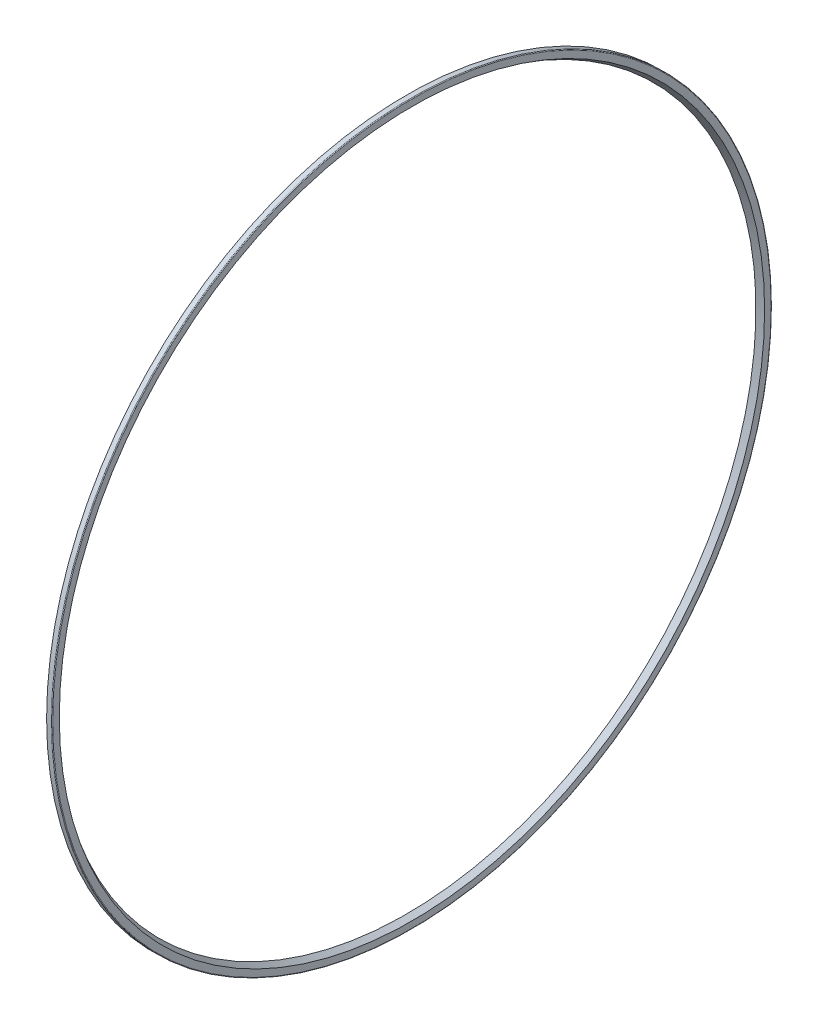
ISO-10303-21;
HEADER;
FILE_DESCRIPTION(('STEP AP214'),'2;1');
FILE_NAME('part.step','',(''),(''),'','','');
FILE_SCHEMA(('AUTOMOTIVE_DESIGN { 1 0 10303 214 1 1 1 1 }'));
ENDSEC;
DATA;
#1=APPLICATION_CONTEXT('core data for automotive mechanical design processes');
#2=APPLICATION_PROTOCOL_DEFINITION('international standard','automotive_design',2000,#1);
#3=PRODUCT_CONTEXT('',#1,'mechanical');
#4=PRODUCT('Part','Part','',(#3));
#5=PRODUCT_RELATED_PRODUCT_CATEGORY('part','',(#4));
#6=PRODUCT_DEFINITION_FORMATION('','',#4);
#7=PRODUCT_DEFINITION_CONTEXT('part definition',#1,'design');
#8=PRODUCT_DEFINITION('design','',#6,#7);
#9=PRODUCT_DEFINITION_SHAPE('','',#8);
#10=(LENGTH_UNIT() NAMED_UNIT(*) SI_UNIT(.MILLI.,.METRE.));
#11=(NAMED_UNIT(*) PLANE_ANGLE_UNIT() SI_UNIT($,.RADIAN.));
#12=(NAMED_UNIT(*) SI_UNIT($,.STERADIAN.) SOLID_ANGLE_UNIT());
#13=UNCERTAINTY_MEASURE_WITH_UNIT(LENGTH_MEASURE(1.E-05),#10,'distance_accuracy_value','');
#14=(GEOMETRIC_REPRESENTATION_CONTEXT(3) GLOBAL_UNCERTAINTY_ASSIGNED_CONTEXT((#13)) GLOBAL_UNIT_ASSIGNED_CONTEXT((#10,
#11,#12)) REPRESENTATION_CONTEXT('',''));
#15=CARTESIAN_POINT('',(0.,0.,0.));
#16=DIRECTION('',(0.,0.,1.));
#17=DIRECTION('',(1.,0.,0.));
#18=AXIS2_PLACEMENT_3D('',#15,#16,#17);
#19=CARTESIAN_POINT('',(0.,-50.3063072555848,-49.755));
#20=DIRECTION('',(-1.,0.,0.));
#21=DIRECTION('',(0.,0.,1.));
#22=AXIS2_PLACEMENT_3D('',#19,#20,#21);
#23=PLANE('',#22);
#24=CARTESIAN_POINT('',(0.,0.,0.));
#25=DIRECTION('',(-1.,0.,0.));
#26=DIRECTION('',(0.,0.,-1.));
#27=AXIS2_PLACEMENT_3D('',#24,#25,#26);
#28=CIRCLE('',#27,49.755);
#29=CARTESIAN_POINT('',(0.,0.,-49.755));
#30=VERTEX_POINT('',#29);
#31=EDGE_CURVE('E34',#30,#30,#28,.F.);
#32=ORIENTED_EDGE('',*,*,#31,.F.);
#33=EDGE_LOOP('',(#32));
#34=FACE_BOUND('',#33,.T.);
#35=CARTESIAN_POINT('',(0.,0.,0.));
#36=DIRECTION('',(1.,0.,0.));
#37=DIRECTION('',(0.,-1.16855737742592E-09,1.));
#38=AXIS2_PLACEMENT_3D('',#35,#36,#37);
#39=CIRCLE('',#38,48.32);
#40=CARTESIAN_POINT('',(0.,-5.64646924772205E-08,48.32));
#41=VERTEX_POINT('',#40);
#42=EDGE_CURVE('E29',#41,#41,#39,.T.);
#43=ORIENTED_EDGE('',*,*,#42,.T.);
#44=EDGE_LOOP('',(#43));
#45=FACE_BOUND('',#44,.T.);
#46=ADVANCED_FACE('F14',(#34,#45),#23,.T.);
#47=CARTESIAN_POINT('',(0.76,-50.205199242003,49.655));
#48=DIRECTION('',(1.,0.,0.));
#49=DIRECTION('',(0.,0.,-1.));
#50=AXIS2_PLACEMENT_3D('',#47,#48,#49);
#51=PLANE('',#50);
#52=CARTESIAN_POINT('',(0.76,0.,0.));
#53=DIRECTION('',(1.,0.,0.));
#54=DIRECTION('',(0.,0.,1.));
#55=AXIS2_PLACEMENT_3D('',#52,#53,#54);
#56=CIRCLE('',#55,49.655);
#57=CARTESIAN_POINT('',(0.76,0.,49.655));
#58=VERTEX_POINT('',#57);
#59=EDGE_CURVE('E25',#58,#58,#56,.T.);
#60=ORIENTED_EDGE('',*,*,#59,.T.);
#61=EDGE_LOOP('',(#60));
#62=FACE_BOUND('',#61,.T.);
#63=CARTESIAN_POINT('',(0.76,0.,0.));
#64=DIRECTION('',(-1.,0.,0.));
#65=DIRECTION('',(0.,0.,-1.));
#66=AXIS2_PLACEMENT_3D('',#63,#64,#65);
#67=CIRCLE('',#66,48.758786204584);
#68=CARTESIAN_POINT('',(0.76,0.,-48.758786204584));
#69=VERTEX_POINT('',#68);
#70=EDGE_CURVE('E21',#69,#69,#67,.F.);
#71=ORIENTED_EDGE('',*,*,#70,.F.);
#72=EDGE_LOOP('',(#71));
#73=FACE_BOUND('',#72,.T.);
#74=ADVANCED_FACE('F43',(#62,#73),#51,.T.);
#75=CARTESIAN_POINT('',(1.,0.,0.));
#76=DIRECTION('',(1.,0.,0.));
#77=DIRECTION('',(0.,1.16846500287246E-09,1.));
#78=AXIS2_PLACEMENT_3D('',#75,#76,#77);
#79=CYLINDRICAL_SURFACE('',#78,49.755);
#80=ORIENTED_EDGE('',*,*,#31,.T.);
#81=EDGE_LOOP('',(#80));
#82=FACE_BOUND('',#81,.T.);
#83=CARTESIAN_POINT('',(0.66,0.,0.));
#84=DIRECTION('',(-1.,0.,0.));
#85=DIRECTION('',(0.,0.,-1.));
#86=AXIS2_PLACEMENT_3D('',#83,#84,#85);
#87=CIRCLE('',#86,49.755);
#88=CARTESIAN_POINT('',(0.66,0.,-49.755));
#89=VERTEX_POINT('',#88);
#90=EDGE_CURVE('E9',#89,#89,#87,.F.);
#91=ORIENTED_EDGE('',*,*,#90,.F.);
#92=EDGE_LOOP('',(#91));
#93=FACE_BOUND('',#92,.T.);
#94=ADVANCED_FACE('F38',(#82,#93),#79,.T.);
#95=CARTESIAN_POINT('',(0.76,0.,0.));
#96=DIRECTION('',(1.,0.,0.));
#97=DIRECTION('',(0.,0.,1.));
#98=AXIS2_PLACEMENT_3D('',#95,#96,#97);
#99=CONICAL_SURFACE('',#98,48.758786204584,0.523598775598188);
#100=ORIENTED_EDGE('',*,*,#70,.T.);
#101=EDGE_LOOP('',(#100));
#102=FACE_BOUND('',#101,.T.);
#103=ORIENTED_EDGE('',*,*,#42,.F.);
#104=EDGE_LOOP('',(#103));
#105=FACE_BOUND('',#104,.T.);
#106=ADVANCED_FACE('F47',(#102,#105),#99,.F.);
#107=CARTESIAN_POINT('',(0.660000000000592,0.,0.));
#108=DIRECTION('',(1.,0.,0.));
#109=DIRECTION('',(0.,1.92331606537063E-10,1.));
#110=AXIS2_PLACEMENT_3D('',#107,#108,#109);
#111=TOROIDAL_SURFACE('',#110,49.6550000000006,0.0999999999994079);
#112=ORIENTED_EDGE('',*,*,#90,.T.);
#113=EDGE_LOOP('',(#112));
#114=FACE_BOUND('',#113,.T.);
#115=ORIENTED_EDGE('',*,*,#59,.F.);
#116=EDGE_LOOP('',(#115));
#117=FACE_BOUND('',#116,.T.);
#118=ADVANCED_FACE('F16',(#114,#117),#111,.T.);
#119=CLOSED_SHELL('',(#46,#74,#94,#106,#118));
#120=MANIFOLD_SOLID_BREP('B1',#119);
#121=ADVANCED_BREP_SHAPE_REPRESENTATION('',(#18,#120),#14);
#122=SHAPE_DEFINITION_REPRESENTATION(#9,#121);
ENDSEC;
END-ISO-10303-21;
